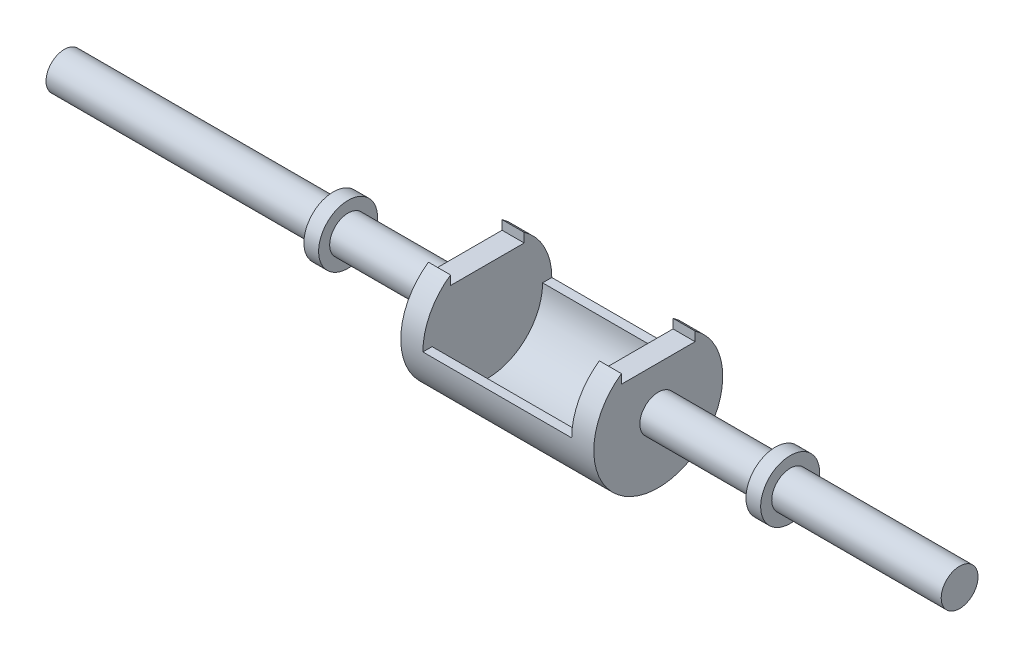
ISO-10303-21;
HEADER;
FILE_DESCRIPTION(('STEP AP214'),'2;1');
FILE_NAME('part.step','',(''),(''),'','','');
FILE_SCHEMA(('AUTOMOTIVE_DESIGN { 1 0 10303 214 1 1 1 1 }'));
ENDSEC;
DATA;
#1=APPLICATION_CONTEXT('core data for automotive mechanical design processes');
#2=APPLICATION_PROTOCOL_DEFINITION('international standard','automotive_design',2000,#1);
#3=PRODUCT_CONTEXT('',#1,'mechanical');
#4=PRODUCT('Part','Part','',(#3));
#5=PRODUCT_RELATED_PRODUCT_CATEGORY('part','',(#4));
#6=PRODUCT_DEFINITION_FORMATION('','',#4);
#7=PRODUCT_DEFINITION_CONTEXT('part definition',#1,'design');
#8=PRODUCT_DEFINITION('design','',#6,#7);
#9=PRODUCT_DEFINITION_SHAPE('','',#8);
#10=(LENGTH_UNIT() NAMED_UNIT(*) SI_UNIT(.MILLI.,.METRE.));
#11=(NAMED_UNIT(*) PLANE_ANGLE_UNIT() SI_UNIT($,.RADIAN.));
#12=(NAMED_UNIT(*) SI_UNIT($,.STERADIAN.) SOLID_ANGLE_UNIT());
#13=UNCERTAINTY_MEASURE_WITH_UNIT(LENGTH_MEASURE(1.E-05),#10,'distance_accuracy_value','');
#14=(GEOMETRIC_REPRESENTATION_CONTEXT(3) GLOBAL_UNCERTAINTY_ASSIGNED_CONTEXT((#13)) GLOBAL_UNIT_ASSIGNED_CONTEXT((#10,
#11,#12)) REPRESENTATION_CONTEXT('',''));
#15=CARTESIAN_POINT('',(0.,0.,0.));
#16=DIRECTION('',(0.,0.,1.));
#17=DIRECTION('',(1.,0.,0.));
#18=AXIS2_PLACEMENT_3D('',#15,#16,#17);
#19=CARTESIAN_POINT('',(-109.707215800696,0.,0.));
#20=DIRECTION('',(-1.,0.,0.));
#21=DIRECTION('',(0.,0.,1.));
#22=AXIS2_PLACEMENT_3D('',#19,#20,#21);
#23=CYLINDRICAL_SURFACE('',#22,5.);
#24=CARTESIAN_POINT('',(26.2,0.,0.));
#25=DIRECTION('',(-1.,0.,0.));
#26=DIRECTION('',(0.,0.,1.));
#27=AXIS2_PLACEMENT_3D('',#24,#25,#26);
#28=CIRCLE('',#27,5.);
#29=CARTESIAN_POINT('',(26.2,0.,5.));
#30=VERTEX_POINT('',#29);
#31=EDGE_CURVE('E243',#30,#30,#28,.T.);
#32=ORIENTED_EDGE('',*,*,#31,.F.);
#33=EDGE_LOOP('',(#32));
#34=FACE_BOUND('',#33,.T.);
#35=CARTESIAN_POINT('',(58.,0.,0.));
#36=DIRECTION('',(1.,0.,0.));
#37=DIRECTION('',(0.,0.,-1.));
#38=AXIS2_PLACEMENT_3D('',#35,#36,#37);
#39=CIRCLE('',#38,5.);
#40=CARTESIAN_POINT('',(58.,0.,-5.));
#41=VERTEX_POINT('',#40);
#42=EDGE_CURVE('E47',#41,#41,#39,.T.);
#43=ORIENTED_EDGE('',*,*,#42,.F.);
#44=EDGE_LOOP('',(#43));
#45=FACE_BOUND('',#44,.T.);
#46=ADVANCED_FACE('F38',(#34,#45),#23,.T.);
#47=CARTESIAN_POINT('',(20.2,15.,0.));
#48=DIRECTION('',(1.,0.,0.));
#49=DIRECTION('',(0.,0.,-1.));
#50=AXIS2_PLACEMENT_3D('',#47,#48,#49);
#51=PLANE('',#50);
#52=CARTESIAN_POINT('',(20.2,0.,0.));
#53=DIRECTION('',(1.,0.,0.));
#54=DIRECTION('',(0.,1.,0.));
#55=AXIS2_PLACEMENT_3D('',#52,#53,#54);
#56=CIRCLE('',#55,17.5);
#57=CARTESIAN_POINT('',(20.2,14.3614066163451,10.));
#58=VERTEX_POINT('',#57);
#59=CARTESIAN_POINT('',(20.2,0.,17.5));
#60=VERTEX_POINT('',#59);
#61=EDGE_CURVE('E221',#58,#60,#56,.T.);
#62=ORIENTED_EDGE('',*,*,#61,.F.);
#63=DIRECTION('',(0.,-1.,0.));
#64=VECTOR('',#63,1.);
#65=CARTESIAN_POINT('',(20.2,15.,10.));
#66=LINE('',#65,#64);
#67=CARTESIAN_POINT('',(20.2,11.8614066163451,10.));
#68=VERTEX_POINT('',#67);
#69=EDGE_CURVE('E192',#58,#68,#66,.T.);
#70=ORIENTED_EDGE('',*,*,#69,.T.);
#71=DIRECTION('',(0.,0.,-1.));
#72=VECTOR('',#71,1.);
#73=CARTESIAN_POINT('',(20.2,11.8614066163451,0.));
#74=LINE('',#73,#72);
#75=CARTESIAN_POINT('',(20.2,11.8614066163451,-10.));
#76=VERTEX_POINT('',#75);
#77=EDGE_CURVE('E184',#68,#76,#74,.T.);
#78=ORIENTED_EDGE('',*,*,#77,.T.);
#79=DIRECTION('',(0.,1.,0.));
#80=VECTOR('',#79,1.);
#81=CARTESIAN_POINT('',(20.2,15.,-10.));
#82=LINE('',#81,#80);
#83=CARTESIAN_POINT('',(20.2,14.3614066163451,-10.));
#84=VERTEX_POINT('',#83);
#85=EDGE_CURVE('E178',#76,#84,#82,.T.);
#86=ORIENTED_EDGE('',*,*,#85,.T.);
#87=CARTESIAN_POINT('',(20.2,0.,-17.5));
#88=VERTEX_POINT('',#87);
#89=EDGE_CURVE('E222',#88,#84,#56,.T.);
#90=ORIENTED_EDGE('',*,*,#89,.F.);
#91=DIRECTION('',(0.,0.,1.));
#92=VECTOR('',#91,1.);
#93=CARTESIAN_POINT('',(20.2,0.,-17.5));
#94=LINE('',#93,#92);
#95=CARTESIAN_POINT('',(20.2,0.,-15.));
#96=VERTEX_POINT('',#95);
#97=EDGE_CURVE('E205',#88,#96,#94,.T.);
#98=ORIENTED_EDGE('',*,*,#97,.T.);
#99=CARTESIAN_POINT('',(20.2,0.,0.));
#100=DIRECTION('',(-1.,0.,0.));
#101=DIRECTION('',(0.,0.,1.));
#102=AXIS2_PLACEMENT_3D('',#99,#100,#101);
#103=CIRCLE('',#102,15.);
#104=CARTESIAN_POINT('',(20.2,0.,15.));
#105=VERTEX_POINT('',#104);
#106=EDGE_CURVE('E235',#96,#105,#103,.T.);
#107=ORIENTED_EDGE('',*,*,#106,.T.);
#108=EDGE_CURVE('E210',#105,#60,#94,.T.);
#109=ORIENTED_EDGE('',*,*,#108,.T.);
#110=EDGE_LOOP('',(#62,#70,#78,#86,#90,#98,#107,#109));
#111=FACE_BOUND('',#110,.T.);
#112=ADVANCED_FACE('F313',(#111),#51,.F.);
#113=CARTESIAN_POINT('',(-109.707215800696,0.,0.));
#114=DIRECTION('',(-1.,0.,0.));
#115=DIRECTION('',(0.,0.,1.));
#116=AXIS2_PLACEMENT_3D('',#113,#114,#115);
#117=CYLINDRICAL_SURFACE('',#116,15.);
#118=CARTESIAN_POINT('',(-20.2,0.,0.));
#119=DIRECTION('',(-1.,0.,0.));
#120=DIRECTION('',(0.,0.,1.));
#121=AXIS2_PLACEMENT_3D('',#118,#119,#120);
#122=CIRCLE('',#121,15.);
#123=CARTESIAN_POINT('',(-20.2,0.,-15.));
#124=VERTEX_POINT('',#123);
#125=CARTESIAN_POINT('',(-20.2,0.,15.));
#126=VERTEX_POINT('',#125);
#127=EDGE_CURVE('E231',#124,#126,#122,.T.);
#128=ORIENTED_EDGE('',*,*,#127,.T.);
#129=DIRECTION('',(-1.,0.,0.));
#130=VECTOR('',#129,1.);
#131=CARTESIAN_POINT('',(-109.707215800696,0.,15.));
#132=LINE('',#131,#130);
#133=EDGE_CURVE('E217',#126,#105,#132,.F.);
#134=ORIENTED_EDGE('',*,*,#133,.T.);
#135=ORIENTED_EDGE('',*,*,#106,.F.);
#136=DIRECTION('',(-1.,0.,0.));
#137=VECTOR('',#136,1.);
#138=CARTESIAN_POINT('',(-109.707215800696,0.,-15.));
#139=LINE('',#138,#137);
#140=EDGE_CURVE('E209',#96,#124,#139,.T.);
#141=ORIENTED_EDGE('',*,*,#140,.T.);
#142=EDGE_LOOP('',(#128,#134,#135,#141));
#143=FACE_BOUND('',#142,.T.);
#144=ADVANCED_FACE('F320',(#143),#117,.F.);
#145=CARTESIAN_POINT('',(-20.2,15.,0.));
#146=DIRECTION('',(-1.,0.,0.));
#147=DIRECTION('',(0.,0.,1.));
#148=AXIS2_PLACEMENT_3D('',#145,#146,#147);
#149=PLANE('',#148);
#150=DIRECTION('',(0.,0.,1.));
#151=VECTOR('',#150,1.);
#152=CARTESIAN_POINT('',(-20.2,11.8614066163451,0.));
#153=LINE('',#152,#151);
#154=CARTESIAN_POINT('',(-20.2,11.8614066163451,-10.));
#155=VERTEX_POINT('',#154);
#156=CARTESIAN_POINT('',(-20.2,11.8614066163451,10.));
#157=VERTEX_POINT('',#156);
#158=EDGE_CURVE('E136',#155,#157,#153,.T.);
#159=ORIENTED_EDGE('',*,*,#158,.T.);
#160=DIRECTION('',(0.,1.,0.));
#161=VECTOR('',#160,1.);
#162=CARTESIAN_POINT('',(-20.2,15.,10.));
#163=LINE('',#162,#161);
#164=CARTESIAN_POINT('',(-20.2,14.3614066163451,10.));
#165=VERTEX_POINT('',#164);
#166=EDGE_CURVE('E188',#157,#165,#163,.T.);
#167=ORIENTED_EDGE('',*,*,#166,.T.);
#168=CARTESIAN_POINT('',(-20.2,0.,0.));
#169=DIRECTION('',(-1.,0.,0.));
#170=DIRECTION('',(0.,-1.,0.));
#171=AXIS2_PLACEMENT_3D('',#168,#169,#170);
#172=CIRCLE('',#171,17.5);
#173=CARTESIAN_POINT('',(-20.2,0.,17.5));
#174=VERTEX_POINT('',#173);
#175=EDGE_CURVE('E227',#174,#165,#172,.T.);
#176=ORIENTED_EDGE('',*,*,#175,.F.);
#177=DIRECTION('',(0.,0.,1.));
#178=VECTOR('',#177,1.);
#179=CARTESIAN_POINT('',(-20.2,0.,-17.5));
#180=LINE('',#179,#178);
#181=EDGE_CURVE('E204',#126,#174,#180,.T.);
#182=ORIENTED_EDGE('',*,*,#181,.F.);
#183=ORIENTED_EDGE('',*,*,#127,.F.);
#184=CARTESIAN_POINT('',(-20.2,0.,-17.5));
#185=VERTEX_POINT('',#184);
#186=EDGE_CURVE('E211',#185,#124,#180,.T.);
#187=ORIENTED_EDGE('',*,*,#186,.F.);
#188=CARTESIAN_POINT('',(-20.2,14.3614066163451,-10.));
#189=VERTEX_POINT('',#188);
#190=EDGE_CURVE('E226',#189,#185,#172,.T.);
#191=ORIENTED_EDGE('',*,*,#190,.F.);
#192=DIRECTION('',(0.,-1.,0.));
#193=VECTOR('',#192,1.);
#194=CARTESIAN_POINT('',(-20.2,15.,-10.));
#195=LINE('',#194,#193);
#196=EDGE_CURVE('E174',#189,#155,#195,.T.);
#197=ORIENTED_EDGE('',*,*,#196,.T.);
#198=EDGE_LOOP('',(#159,#167,#176,#182,#183,#187,#191,#197));
#199=FACE_BOUND('',#198,.T.);
#200=ADVANCED_FACE('F323',(#199),#149,.F.);
#201=CARTESIAN_POINT('',(-20.2,0.,-17.5));
#202=DIRECTION('',(0.,-1.,0.));
#203=DIRECTION('',(1.,0.,0.));
#204=AXIS2_PLACEMENT_3D('',#201,#202,#203);
#205=PLANE('',#204);
#206=ORIENTED_EDGE('',*,*,#181,.T.);
#207=DIRECTION('',(1.,0.,0.));
#208=VECTOR('',#207,1.);
#209=CARTESIAN_POINT('',(-20.2,0.,17.5));
#210=LINE('',#209,#208);
#211=EDGE_CURVE('E196',#174,#60,#210,.T.);
#212=ORIENTED_EDGE('',*,*,#211,.T.);
#213=ORIENTED_EDGE('',*,*,#108,.F.);
#214=ORIENTED_EDGE('',*,*,#133,.F.);
#215=EDGE_LOOP('',(#206,#212,#213,#214));
#216=FACE_BOUND('',#215,.T.);
#217=ADVANCED_FACE('F335',(#216),#205,.F.);
#218=ORIENTED_EDGE('',*,*,#97,.F.);
#219=DIRECTION('',(1.,0.,0.));
#220=VECTOR('',#219,1.);
#221=CARTESIAN_POINT('',(-20.2,0.,-17.5));
#222=LINE('',#221,#220);
#223=EDGE_CURVE('E200',#185,#88,#222,.T.);
#224=ORIENTED_EDGE('',*,*,#223,.F.);
#225=ORIENTED_EDGE('',*,*,#186,.T.);
#226=ORIENTED_EDGE('',*,*,#140,.F.);
#227=EDGE_LOOP('',(#218,#224,#225,#226));
#228=FACE_BOUND('',#227,.T.);
#229=ADVANCED_FACE('F316',(#228),#205,.F.);
#230=CARTESIAN_POINT('',(-109.707215800696,0.,0.));
#231=DIRECTION('',(-1.,0.,0.));
#232=DIRECTION('',(0.,0.,1.));
#233=AXIS2_PLACEMENT_3D('',#230,#231,#232);
#234=CYLINDRICAL_SURFACE('',#233,17.5);
#235=CARTESIAN_POINT('',(26.2,0.,0.));
#236=DIRECTION('',(-1.,0.,0.));
#237=DIRECTION('',(0.,0.,1.));
#238=AXIS2_PLACEMENT_3D('',#235,#236,#237);
#239=CIRCLE('',#238,17.5);
#240=CARTESIAN_POINT('',(26.2,14.3614066163451,-10.));
#241=VERTEX_POINT('',#240);
#242=CARTESIAN_POINT('',(26.2,14.3614066163451,10.));
#243=VERTEX_POINT('',#242);
#244=EDGE_CURVE('E247',#241,#243,#239,.T.);
#245=ORIENTED_EDGE('',*,*,#244,.T.);
#246=DIRECTION('',(-1.,0.,0.));
#247=VECTOR('',#246,1.);
#248=CARTESIAN_POINT('',(46.979647142004,14.3614066163451,10.));
#249=LINE('',#248,#247);
#250=EDGE_CURVE('E157',#243,#58,#249,.T.);
#251=ORIENTED_EDGE('',*,*,#250,.T.);
#252=ORIENTED_EDGE('',*,*,#61,.T.);
#253=ORIENTED_EDGE('',*,*,#211,.F.);
#254=ORIENTED_EDGE('',*,*,#175,.T.);
#255=CARTESIAN_POINT('',(-26.2,14.3614066163451,10.));
#256=VERTEX_POINT('',#255);
#257=EDGE_CURVE('E162',#165,#256,#249,.T.);
#258=ORIENTED_EDGE('',*,*,#257,.T.);
#259=CARTESIAN_POINT('',(-26.2,0.,0.));
#260=DIRECTION('',(-1.,0.,0.));
#261=DIRECTION('',(0.,0.,1.));
#262=AXIS2_PLACEMENT_3D('',#259,#260,#261);
#263=CIRCLE('',#262,17.5);
#264=CARTESIAN_POINT('',(-26.2,14.3614066163451,-10.));
#265=VERTEX_POINT('',#264);
#266=EDGE_CURVE('E251',#265,#256,#263,.T.);
#267=ORIENTED_EDGE('',*,*,#266,.F.);
#268=DIRECTION('',(-1.,0.,0.));
#269=VECTOR('',#268,1.);
#270=CARTESIAN_POINT('',(46.979647142004,14.3614066163451,-10.));
#271=LINE('',#270,#269);
#272=EDGE_CURVE('E54',#189,#265,#271,.T.);
#273=ORIENTED_EDGE('',*,*,#272,.F.);
#274=ORIENTED_EDGE('',*,*,#190,.T.);
#275=ORIENTED_EDGE('',*,*,#223,.T.);
#276=ORIENTED_EDGE('',*,*,#89,.T.);
#277=EDGE_CURVE('E139',#241,#84,#271,.T.);
#278=ORIENTED_EDGE('',*,*,#277,.F.);
#279=EDGE_LOOP('',(#245,#251,#252,#253,#254,#258,#267,#273,#274,#275,#276,#278));
#280=FACE_BOUND('',#279,.T.);
#281=ADVANCED_FACE('F308',(#280),#234,.T.);
#282=CARTESIAN_POINT('',(-109.707215800696,0.,0.));
#283=DIRECTION('',(-1.,0.,0.));
#284=DIRECTION('',(0.,0.,1.));
#285=AXIS2_PLACEMENT_3D('',#282,#283,#284);
#286=CYLINDRICAL_SURFACE('',#285,5.);
#287=CARTESIAN_POINT('',(-58.,0.,0.));
#288=DIRECTION('',(1.,0.,0.));
#289=DIRECTION('',(0.,0.,-1.));
#290=AXIS2_PLACEMENT_3D('',#287,#288,#289);
#291=CIRCLE('',#290,5.);
#292=CARTESIAN_POINT('',(-58.,0.,-5.));
#293=VERTEX_POINT('',#292);
#294=EDGE_CURVE('E268',#293,#293,#291,.T.);
#295=ORIENTED_EDGE('',*,*,#294,.T.);
#296=EDGE_LOOP('',(#295));
#297=FACE_BOUND('',#296,.T.);
#298=CARTESIAN_POINT('',(-26.2,0.,0.));
#299=DIRECTION('',(-1.,0.,0.));
#300=DIRECTION('',(0.,0.,1.));
#301=AXIS2_PLACEMENT_3D('',#298,#299,#300);
#302=CIRCLE('',#301,5.);
#303=CARTESIAN_POINT('',(-26.2,0.,5.));
#304=VERTEX_POINT('',#303);
#305=EDGE_CURVE('E254',#304,#304,#302,.T.);
#306=ORIENTED_EDGE('',*,*,#305,.T.);
#307=EDGE_LOOP('',(#306));
#308=FACE_BOUND('',#307,.T.);
#309=ADVANCED_FACE('F400',(#297,#308),#286,.T.);
#310=CARTESIAN_POINT('',(-26.2,5.,0.));
#311=DIRECTION('',(1.,0.,0.));
#312=DIRECTION('',(0.,0.,-1.));
#313=AXIS2_PLACEMENT_3D('',#310,#311,#312);
#314=PLANE('',#313);
#315=ORIENTED_EDGE('',*,*,#305,.F.);
#316=EDGE_LOOP('',(#315));
#317=FACE_BOUND('',#316,.T.);
#318=ORIENTED_EDGE('',*,*,#266,.T.);
#319=DIRECTION('',(0.,1.,0.));
#320=VECTOR('',#319,1.);
#321=CARTESIAN_POINT('',(-26.2,14.3614066163451,10.));
#322=LINE('',#321,#320);
#323=CARTESIAN_POINT('',(-26.2,11.8614066163451,10.));
#324=VERTEX_POINT('',#323);
#325=EDGE_CURVE('E150',#324,#256,#322,.T.);
#326=ORIENTED_EDGE('',*,*,#325,.F.);
#327=DIRECTION('',(0.,0.,1.));
#328=VECTOR('',#327,1.);
#329=CARTESIAN_POINT('',(-26.2,11.8614066163451,-10.));
#330=LINE('',#329,#328);
#331=CARTESIAN_POINT('',(-26.2,11.8614066163451,-10.));
#332=VERTEX_POINT('',#331);
#333=EDGE_CURVE('E133',#332,#324,#330,.T.);
#334=ORIENTED_EDGE('',*,*,#333,.F.);
#335=DIRECTION('',(0.,-1.,0.));
#336=VECTOR('',#335,1.);
#337=CARTESIAN_POINT('',(-26.2,14.3614066163451,-10.));
#338=LINE('',#337,#336);
#339=EDGE_CURVE('E141',#265,#332,#338,.T.);
#340=ORIENTED_EDGE('',*,*,#339,.F.);
#341=EDGE_LOOP('',(#318,#326,#334,#340));
#342=FACE_BOUND('',#341,.T.);
#343=ADVANCED_FACE('F149',(#317,#342),#314,.F.);
#344=CARTESIAN_POINT('',(26.2,17.5,0.));
#345=DIRECTION('',(-1.,0.,0.));
#346=DIRECTION('',(0.,0.,1.));
#347=AXIS2_PLACEMENT_3D('',#344,#345,#346);
#348=PLANE('',#347);
#349=DIRECTION('',(0.,0.,-1.));
#350=VECTOR('',#349,1.);
#351=CARTESIAN_POINT('',(26.2,11.8614066163451,-10.));
#352=LINE('',#351,#350);
#353=CARTESIAN_POINT('',(26.2,11.8614066163451,10.));
#354=VERTEX_POINT('',#353);
#355=CARTESIAN_POINT('',(26.2,11.8614066163451,-10.));
#356=VERTEX_POINT('',#355);
#357=EDGE_CURVE('E161',#354,#356,#352,.T.);
#358=ORIENTED_EDGE('',*,*,#357,.F.);
#359=DIRECTION('',(0.,-1.,0.));
#360=VECTOR('',#359,1.);
#361=CARTESIAN_POINT('',(26.2,14.3614066163451,10.));
#362=LINE('',#361,#360);
#363=EDGE_CURVE('E175',#243,#354,#362,.T.);
#364=ORIENTED_EDGE('',*,*,#363,.F.);
#365=ORIENTED_EDGE('',*,*,#244,.F.);
#366=DIRECTION('',(0.,1.,0.));
#367=VECTOR('',#366,1.);
#368=CARTESIAN_POINT('',(26.2,14.3614066163451,-10.));
#369=LINE('',#368,#367);
#370=EDGE_CURVE('E171',#356,#241,#369,.T.);
#371=ORIENTED_EDGE('',*,*,#370,.F.);
#372=EDGE_LOOP('',(#358,#364,#365,#371));
#373=FACE_BOUND('',#372,.T.);
#374=ORIENTED_EDGE('',*,*,#31,.T.);
#375=EDGE_LOOP('',(#374));
#376=FACE_BOUND('',#375,.T.);
#377=ADVANCED_FACE('F303',(#373,#376),#348,.F.);
#378=CARTESIAN_POINT('',(46.979647142004,14.3614066163451,-10.));
#379=DIRECTION('',(0.,0.,-1.));
#380=DIRECTION('',(-1.,0.,0.));
#381=AXIS2_PLACEMENT_3D('',#378,#379,#380);
#382=PLANE('',#381);
#383=DIRECTION('',(-1.,0.,0.));
#384=VECTOR('',#383,1.);
#385=CARTESIAN_POINT('',(46.979647142004,11.8614066163451,-10.));
#386=LINE('',#385,#384);
#387=EDGE_CURVE('E62',#356,#76,#386,.T.);
#388=ORIENTED_EDGE('',*,*,#387,.F.);
#389=ORIENTED_EDGE('',*,*,#370,.T.);
#390=ORIENTED_EDGE('',*,*,#277,.T.);
#391=ORIENTED_EDGE('',*,*,#85,.F.);
#392=EDGE_LOOP('',(#388,#389,#390,#391));
#393=FACE_BOUND('',#392,.T.);
#394=ADVANCED_FACE('F306',(#393),#382,.F.);
#395=CARTESIAN_POINT('',(46.979647142004,11.8614066163451,-10.));
#396=DIRECTION('',(0.,-1.,0.));
#397=DIRECTION('',(0.,0.,-1.));
#398=AXIS2_PLACEMENT_3D('',#395,#396,#397);
#399=PLANE('',#398);
#400=DIRECTION('',(-1.,0.,0.));
#401=VECTOR('',#400,1.);
#402=CARTESIAN_POINT('',(46.979647142004,11.8614066163451,10.));
#403=LINE('',#402,#401);
#404=EDGE_CURVE('E163',#354,#68,#403,.T.);
#405=ORIENTED_EDGE('',*,*,#404,.F.);
#406=ORIENTED_EDGE('',*,*,#357,.T.);
#407=ORIENTED_EDGE('',*,*,#387,.T.);
#408=ORIENTED_EDGE('',*,*,#77,.F.);
#409=EDGE_LOOP('',(#405,#406,#407,#408));
#410=FACE_BOUND('',#409,.T.);
#411=ADVANCED_FACE('F301',(#410),#399,.F.);
#412=CARTESIAN_POINT('',(46.979647142004,14.3614066163451,10.));
#413=DIRECTION('',(0.,0.,1.));
#414=DIRECTION('',(1.,0.,0.));
#415=AXIS2_PLACEMENT_3D('',#412,#413,#414);
#416=PLANE('',#415);
#417=ORIENTED_EDGE('',*,*,#250,.F.);
#418=ORIENTED_EDGE('',*,*,#363,.T.);
#419=ORIENTED_EDGE('',*,*,#404,.T.);
#420=ORIENTED_EDGE('',*,*,#69,.F.);
#421=EDGE_LOOP('',(#417,#418,#419,#420));
#422=FACE_BOUND('',#421,.T.);
#423=ADVANCED_FACE('F296',(#422),#416,.F.);
#424=EDGE_CURVE('E166',#157,#324,#403,.T.);
#425=ORIENTED_EDGE('',*,*,#424,.T.);
#426=ORIENTED_EDGE('',*,*,#325,.T.);
#427=ORIENTED_EDGE('',*,*,#257,.F.);
#428=ORIENTED_EDGE('',*,*,#166,.F.);
#429=EDGE_LOOP('',(#425,#426,#427,#428));
#430=FACE_BOUND('',#429,.T.);
#431=ADVANCED_FACE('F391',(#430),#416,.F.);
#432=EDGE_CURVE('E129',#155,#332,#386,.T.);
#433=ORIENTED_EDGE('',*,*,#432,.T.);
#434=ORIENTED_EDGE('',*,*,#333,.T.);
#435=ORIENTED_EDGE('',*,*,#424,.F.);
#436=ORIENTED_EDGE('',*,*,#158,.F.);
#437=EDGE_LOOP('',(#433,#434,#435,#436));
#438=FACE_BOUND('',#437,.T.);
#439=ADVANCED_FACE('F130',(#438),#399,.F.);
#440=ORIENTED_EDGE('',*,*,#272,.T.);
#441=ORIENTED_EDGE('',*,*,#339,.T.);
#442=ORIENTED_EDGE('',*,*,#432,.F.);
#443=ORIENTED_EDGE('',*,*,#196,.F.);
#444=EDGE_LOOP('',(#440,#441,#442,#443));
#445=FACE_BOUND('',#444,.T.);
#446=ADVANCED_FACE('F142',(#445),#382,.F.);
#447=CARTESIAN_POINT('',(58.,0.,0.));
#448=DIRECTION('',(1.,0.,0.));
#449=DIRECTION('',(0.,0.,-1.));
#450=AXIS2_PLACEMENT_3D('',#447,#448,#449);
#451=CYLINDRICAL_SURFACE('',#450,8.);
#452=CARTESIAN_POINT('',(58.,0.,0.));
#453=DIRECTION('',(1.,0.,0.));
#454=DIRECTION('',(0.,0.,-1.));
#455=AXIS2_PLACEMENT_3D('',#452,#453,#454);
#456=CIRCLE('',#455,8.);
#457=CARTESIAN_POINT('',(58.,0.,-8.));
#458=VERTEX_POINT('',#457);
#459=EDGE_CURVE('E265',#458,#458,#456,.T.);
#460=ORIENTED_EDGE('',*,*,#459,.T.);
#461=EDGE_LOOP('',(#460));
#462=FACE_BOUND('',#461,.T.);
#463=CARTESIAN_POINT('',(62.,0.,0.));
#464=DIRECTION('',(1.,0.,0.));
#465=DIRECTION('',(0.,0.,-1.));
#466=AXIS2_PLACEMENT_3D('',#463,#464,#465);
#467=CIRCLE('',#466,8.);
#468=CARTESIAN_POINT('',(62.,0.,-8.));
#469=VERTEX_POINT('',#468);
#470=EDGE_CURVE('E271',#469,#469,#467,.T.);
#471=ORIENTED_EDGE('',*,*,#470,.F.);
#472=EDGE_LOOP('',(#471));
#473=FACE_BOUND('',#472,.T.);
#474=ADVANCED_FACE('F378',(#462,#473),#451,.T.);
#475=CARTESIAN_POINT('',(58.,0.,0.));
#476=DIRECTION('',(1.,0.,0.));
#477=DIRECTION('',(0.,0.,-1.));
#478=AXIS2_PLACEMENT_3D('',#475,#476,#477);
#479=PLANE('',#478);
#480=ORIENTED_EDGE('',*,*,#42,.T.);
#481=EDGE_LOOP('',(#480));
#482=FACE_BOUND('',#481,.T.);
#483=ORIENTED_EDGE('',*,*,#459,.F.);
#484=EDGE_LOOP('',(#483));
#485=FACE_BOUND('',#484,.T.);
#486=ADVANCED_FACE('F374',(#482,#485),#479,.F.);
#487=CARTESIAN_POINT('',(62.,0.,0.));
#488=DIRECTION('',(1.,0.,0.));
#489=DIRECTION('',(0.,0.,-1.));
#490=AXIS2_PLACEMENT_3D('',#487,#488,#489);
#491=PLANE('',#490);
#492=CARTESIAN_POINT('',(62.,0.,0.));
#493=DIRECTION('',(1.,0.,0.));
#494=DIRECTION('',(0.,0.,-1.));
#495=AXIS2_PLACEMENT_3D('',#492,#493,#494);
#496=CIRCLE('',#495,5.);
#497=CARTESIAN_POINT('',(62.,0.,-5.));
#498=VERTEX_POINT('',#497);
#499=EDGE_CURVE('E147',#498,#498,#496,.T.);
#500=ORIENTED_EDGE('',*,*,#499,.F.);
#501=EDGE_LOOP('',(#500));
#502=FACE_BOUND('',#501,.T.);
#503=ORIENTED_EDGE('',*,*,#470,.T.);
#504=EDGE_LOOP('',(#503));
#505=FACE_BOUND('',#504,.T.);
#506=ADVANCED_FACE('F366',(#502,#505),#491,.T.);
#507=CARTESIAN_POINT('',(108.,5.,0.));
#508=DIRECTION('',(-1.,0.,0.));
#509=DIRECTION('',(0.,0.,1.));
#510=AXIS2_PLACEMENT_3D('',#507,#508,#509);
#511=PLANE('',#510);
#512=CARTESIAN_POINT('',(108.,0.,0.));
#513=DIRECTION('',(-1.,0.,0.));
#514=DIRECTION('',(0.,0.,1.));
#515=AXIS2_PLACEMENT_3D('',#512,#513,#514);
#516=CIRCLE('',#515,5.);
#517=CARTESIAN_POINT('',(108.,0.,5.));
#518=VERTEX_POINT('',#517);
#519=EDGE_CURVE('E239',#518,#518,#516,.T.);
#520=ORIENTED_EDGE('',*,*,#519,.F.);
#521=EDGE_LOOP('',(#520));
#522=FACE_BOUND('',#521,.T.);
#523=ADVANCED_FACE('F358',(#522),#511,.F.);
#524=ORIENTED_EDGE('',*,*,#499,.T.);
#525=EDGE_LOOP('',(#524));
#526=FACE_BOUND('',#525,.T.);
#527=ORIENTED_EDGE('',*,*,#519,.T.);
#528=EDGE_LOOP('',(#527));
#529=FACE_BOUND('',#528,.T.);
#530=ADVANCED_FACE('F347',(#526,#529),#23,.T.);
#531=CARTESIAN_POINT('',(-62.,0.,0.));
#532=DIRECTION('',(1.,0.,0.));
#533=DIRECTION('',(0.,0.,-1.));
#534=AXIS2_PLACEMENT_3D('',#531,#532,#533);
#535=CYLINDRICAL_SURFACE('',#534,8.);
#536=CARTESIAN_POINT('',(-62.,0.,0.));
#537=DIRECTION('',(1.,0.,0.));
#538=DIRECTION('',(0.,0.,-1.));
#539=AXIS2_PLACEMENT_3D('',#536,#537,#538);
#540=CIRCLE('',#539,8.);
#541=CARTESIAN_POINT('',(-62.,0.,-8.));
#542=VERTEX_POINT('',#541);
#543=EDGE_CURVE('E272',#542,#542,#540,.T.);
#544=ORIENTED_EDGE('',*,*,#543,.T.);
#545=EDGE_LOOP('',(#544));
#546=FACE_BOUND('',#545,.T.);
#547=CARTESIAN_POINT('',(-58.,0.,0.));
#548=DIRECTION('',(1.,0.,0.));
#549=DIRECTION('',(0.,0.,-1.));
#550=AXIS2_PLACEMENT_3D('',#547,#548,#549);
#551=CIRCLE('',#550,8.);
#552=CARTESIAN_POINT('',(-58.,0.,-8.));
#553=VERTEX_POINT('',#552);
#554=EDGE_CURVE('E280',#553,#553,#551,.T.);
#555=ORIENTED_EDGE('',*,*,#554,.F.);
#556=EDGE_LOOP('',(#555));
#557=FACE_BOUND('',#556,.T.);
#558=ADVANCED_FACE('F357',(#546,#557),#535,.T.);
#559=CARTESIAN_POINT('',(-62.,0.,0.));
#560=DIRECTION('',(1.,0.,0.));
#561=DIRECTION('',(0.,0.,-1.));
#562=AXIS2_PLACEMENT_3D('',#559,#560,#561);
#563=PLANE('',#562);
#564=CARTESIAN_POINT('',(-62.,0.,0.));
#565=DIRECTION('',(1.,0.,0.));
#566=DIRECTION('',(0.,0.,-1.));
#567=AXIS2_PLACEMENT_3D('',#564,#565,#566);
#568=CIRCLE('',#567,5.);
#569=CARTESIAN_POINT('',(-62.,0.,-5.));
#570=VERTEX_POINT('',#569);
#571=EDGE_CURVE('E11',#570,#570,#568,.T.);
#572=ORIENTED_EDGE('',*,*,#571,.T.);
#573=EDGE_LOOP('',(#572));
#574=FACE_BOUND('',#573,.T.);
#575=ORIENTED_EDGE('',*,*,#543,.F.);
#576=EDGE_LOOP('',(#575));
#577=FACE_BOUND('',#576,.T.);
#578=ADVANCED_FACE('F364',(#574,#577),#563,.F.);
#579=CARTESIAN_POINT('',(-58.,0.,0.));
#580=DIRECTION('',(1.,0.,0.));
#581=DIRECTION('',(0.,0.,-1.));
#582=AXIS2_PLACEMENT_3D('',#579,#580,#581);
#583=PLANE('',#582);
#584=ORIENTED_EDGE('',*,*,#294,.F.);
#585=EDGE_LOOP('',(#584));
#586=FACE_BOUND('',#585,.T.);
#587=ORIENTED_EDGE('',*,*,#554,.T.);
#588=EDGE_LOOP('',(#587));
#589=FACE_BOUND('',#588,.T.);
#590=ADVANCED_FACE('F415',(#586,#589),#583,.T.);
#591=CARTESIAN_POINT('',(-135.,5.,0.));
#592=DIRECTION('',(1.,0.,0.));
#593=DIRECTION('',(0.,0.,-1.));
#594=AXIS2_PLACEMENT_3D('',#591,#592,#593);
#595=PLANE('',#594);
#596=CARTESIAN_POINT('',(-135.,0.,0.));
#597=DIRECTION('',(-1.,0.,0.));
#598=DIRECTION('',(0.,0.,1.));
#599=AXIS2_PLACEMENT_3D('',#596,#597,#598);
#600=CIRCLE('',#599,5.);
#601=CARTESIAN_POINT('',(-135.,0.,5.));
#602=VERTEX_POINT('',#601);
#603=EDGE_CURVE('E258',#602,#602,#600,.T.);
#604=ORIENTED_EDGE('',*,*,#603,.T.);
#605=EDGE_LOOP('',(#604));
#606=FACE_BOUND('',#605,.T.);
#607=ADVANCED_FACE('F40',(#606),#595,.F.);
#608=ORIENTED_EDGE('',*,*,#603,.F.);
#609=EDGE_LOOP('',(#608));
#610=FACE_BOUND('',#609,.T.);
#611=ORIENTED_EDGE('',*,*,#571,.F.);
#612=EDGE_LOOP('',(#611));
#613=FACE_BOUND('',#612,.T.);
#614=ADVANCED_FACE('F406',(#610,#613),#286,.T.);
#615=CLOSED_SHELL('',(#46,#112,#144,#200,#217,#229,#281,#309,#343,#377,#394,#411,#423,#431,#439,
#446,#474,#486,#506,#523,#530,#558,#578,#590,#607,#614));
#616=MANIFOLD_SOLID_BREP('B2',#615);
#617=ADVANCED_BREP_SHAPE_REPRESENTATION('',(#18,#616),#14);
#618=SHAPE_DEFINITION_REPRESENTATION(#9,#617);
ENDSEC;
END-ISO-10303-21;
